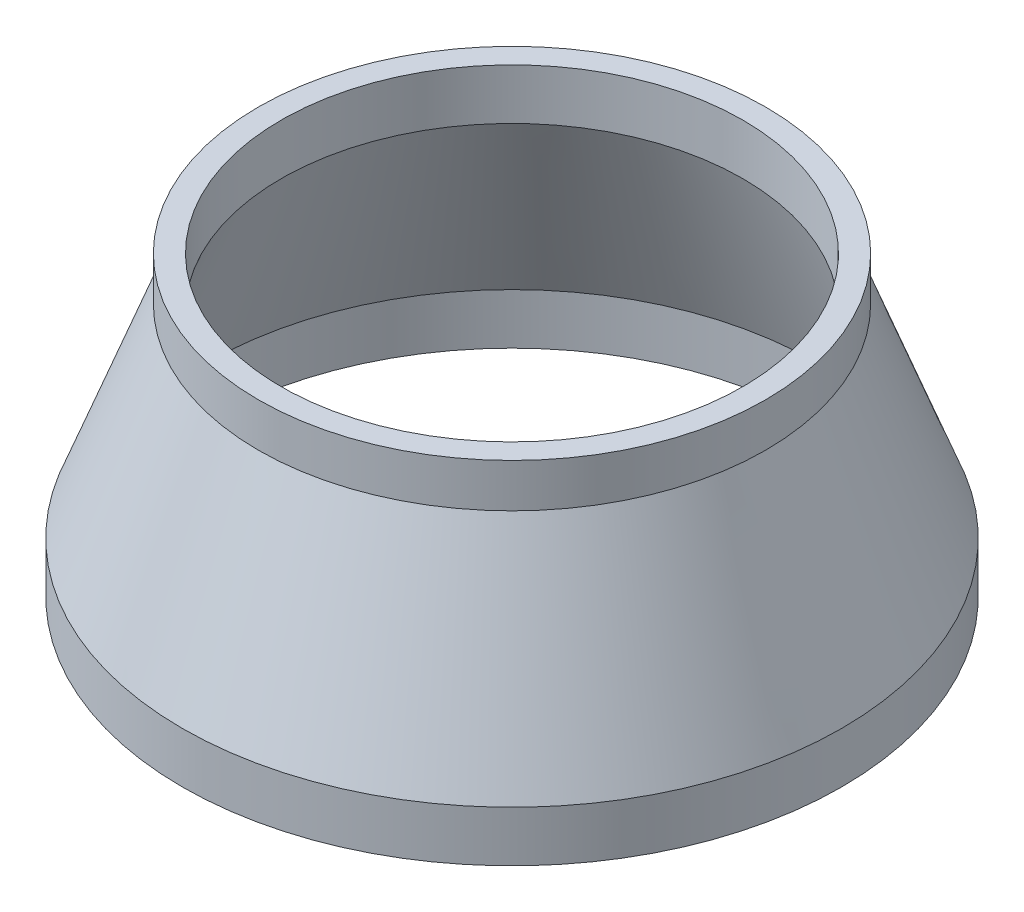
ISO-10303-21;
HEADER;
FILE_DESCRIPTION(('STEP AP214'),'2;1');
FILE_NAME('part.step','',(''),(''),'','','');
FILE_SCHEMA(('AUTOMOTIVE_DESIGN { 1 0 10303 214 1 1 1 1 }'));
ENDSEC;
DATA;
#1=APPLICATION_CONTEXT('core data for automotive mechanical design processes');
#2=APPLICATION_PROTOCOL_DEFINITION('international standard','automotive_design',2000,#1);
#3=PRODUCT_CONTEXT('',#1,'mechanical');
#4=PRODUCT('Part','Part','',(#3));
#5=PRODUCT_RELATED_PRODUCT_CATEGORY('part','',(#4));
#6=PRODUCT_DEFINITION_FORMATION('','',#4);
#7=PRODUCT_DEFINITION_CONTEXT('part definition',#1,'design');
#8=PRODUCT_DEFINITION('design','',#6,#7);
#9=PRODUCT_DEFINITION_SHAPE('','',#8);
#10=(LENGTH_UNIT() NAMED_UNIT(*) SI_UNIT(.MILLI.,.METRE.));
#11=(NAMED_UNIT(*) PLANE_ANGLE_UNIT() SI_UNIT($,.RADIAN.));
#12=(NAMED_UNIT(*) SI_UNIT($,.STERADIAN.) SOLID_ANGLE_UNIT());
#13=UNCERTAINTY_MEASURE_WITH_UNIT(LENGTH_MEASURE(1.E-05),#10,'distance_accuracy_value','');
#14=(GEOMETRIC_REPRESENTATION_CONTEXT(3) GLOBAL_UNCERTAINTY_ASSIGNED_CONTEXT((#13)) GLOBAL_UNIT_ASSIGNED_CONTEXT((#10,
#11,#12)) REPRESENTATION_CONTEXT('',''));
#15=CARTESIAN_POINT('',(0.,0.,0.));
#16=DIRECTION('',(0.,0.,1.));
#17=DIRECTION('',(1.,0.,0.));
#18=AXIS2_PLACEMENT_3D('',#15,#16,#17);
#19=CARTESIAN_POINT('',(0.,0.,0.));
#20=DIRECTION('',(0.,-1.,0.));
#21=DIRECTION('',(0.,0.,-1.));
#22=AXIS2_PLACEMENT_3D('',#19,#20,#21);
#23=CYLINDRICAL_SURFACE('',#22,38.1);
#24=CARTESIAN_POINT('',(0.,-6.35,0.));
#25=DIRECTION('',(0.,-1.,0.));
#26=DIRECTION('',(0.,0.,-1.));
#27=AXIS2_PLACEMENT_3D('',#24,#25,#26);
#28=CIRCLE('',#27,38.1);
#29=CARTESIAN_POINT('',(0.,-6.35,-38.1));
#30=VERTEX_POINT('',#29);
#31=EDGE_CURVE('E59',#30,#30,#28,.T.);
#32=ORIENTED_EDGE('',*,*,#31,.T.);
#33=EDGE_LOOP('',(#32));
#34=FACE_BOUND('',#33,.T.);
#35=CARTESIAN_POINT('',(0.,0.,0.));
#36=DIRECTION('',(0.,-1.,0.));
#37=DIRECTION('',(0.,0.,-1.));
#38=AXIS2_PLACEMENT_3D('',#35,#36,#37);
#39=CIRCLE('',#38,38.1);
#40=CARTESIAN_POINT('',(0.,0.,-38.1));
#41=VERTEX_POINT('',#40);
#42=EDGE_CURVE('E10',#41,#41,#39,.T.);
#43=ORIENTED_EDGE('',*,*,#42,.F.);
#44=EDGE_LOOP('',(#43));
#45=FACE_BOUND('',#44,.T.);
#46=ADVANCED_FACE('F31',(#34,#45),#23,.F.);
#47=CARTESIAN_POINT('',(0.,24.514709031602,0.));
#48=DIRECTION('',(0.,-1.,0.));
#49=DIRECTION('',(0.,0.,-1.));
#50=AXIS2_PLACEMENT_3D('',#47,#48,#49);
#51=CONICAL_SURFACE('',#50,28.9069841131492,0.358770670270572);
#52=ORIENTED_EDGE('',*,*,#42,.T.);
#53=EDGE_LOOP('',(#52));
#54=FACE_BOUND('',#53,.T.);
#55=CARTESIAN_POINT('',(0.,24.514709031602,0.));
#56=DIRECTION('',(0.,-1.,0.));
#57=DIRECTION('',(0.,0.,-1.));
#58=AXIS2_PLACEMENT_3D('',#55,#56,#57);
#59=CIRCLE('',#58,28.9069841131492);
#60=CARTESIAN_POINT('',(0.,24.514709031602,-28.9069841131492));
#61=VERTEX_POINT('',#60);
#62=EDGE_CURVE('E37',#61,#61,#59,.T.);
#63=ORIENTED_EDGE('',*,*,#62,.F.);
#64=EDGE_LOOP('',(#63));
#65=FACE_BOUND('',#64,.T.);
#66=ADVANCED_FACE('F77',(#54,#65),#51,.F.);
#67=CARTESIAN_POINT('',(0.,0.,0.));
#68=DIRECTION('',(0.,-1.,0.));
#69=DIRECTION('',(0.,0.,-1.));
#70=AXIS2_PLACEMENT_3D('',#67,#68,#69);
#71=CYLINDRICAL_SURFACE('',#70,28.9069841131492);
#72=ORIENTED_EDGE('',*,*,#62,.T.);
#73=EDGE_LOOP('',(#72));
#74=FACE_BOUND('',#73,.T.);
#75=CARTESIAN_POINT('',(0.,30.864709031602,0.));
#76=DIRECTION('',(0.,-1.,0.));
#77=DIRECTION('',(0.,0.,-1.));
#78=AXIS2_PLACEMENT_3D('',#75,#76,#77);
#79=CIRCLE('',#78,28.9069841131492);
#80=CARTESIAN_POINT('',(0.,30.864709031602,-28.9069841131492));
#81=VERTEX_POINT('',#80);
#82=EDGE_CURVE('E41',#81,#81,#79,.T.);
#83=ORIENTED_EDGE('',*,*,#82,.F.);
#84=EDGE_LOOP('',(#83));
#85=FACE_BOUND('',#84,.T.);
#86=ADVANCED_FACE('F81',(#74,#85),#71,.F.);
#87=CARTESIAN_POINT('',(28.9069841131492,30.864709031602,0.));
#88=DIRECTION('',(0.,1.,0.));
#89=DIRECTION('',(0.,0.,1.));
#90=AXIS2_PLACEMENT_3D('',#87,#88,#89);
#91=PLANE('',#90);
#92=ORIENTED_EDGE('',*,*,#82,.T.);
#93=EDGE_LOOP('',(#92));
#94=FACE_BOUND('',#93,.T.);
#95=CARTESIAN_POINT('',(0.,30.864709031602,0.));
#96=DIRECTION('',(0.,-1.,0.));
#97=DIRECTION('',(0.,0.,-1.));
#98=AXIS2_PLACEMENT_3D('',#95,#96,#97);
#99=CIRCLE('',#98,31.75);
#100=CARTESIAN_POINT('',(0.,30.864709031602,-31.75));
#101=VERTEX_POINT('',#100);
#102=EDGE_CURVE('E45',#101,#101,#99,.T.);
#103=ORIENTED_EDGE('',*,*,#102,.F.);
#104=EDGE_LOOP('',(#103));
#105=FACE_BOUND('',#104,.T.);
#106=ADVANCED_FACE('F85',(#94,#105),#91,.T.);
#107=CARTESIAN_POINT('',(0.,0.,0.));
#108=DIRECTION('',(0.,-1.,0.));
#109=DIRECTION('',(0.,0.,-1.));
#110=AXIS2_PLACEMENT_3D('',#107,#108,#109);
#111=CYLINDRICAL_SURFACE('',#110,31.75);
#112=ORIENTED_EDGE('',*,*,#102,.T.);
#113=EDGE_LOOP('',(#112));
#114=FACE_BOUND('',#113,.T.);
#115=CARTESIAN_POINT('',(0.,25.4,0.));
#116=DIRECTION('',(0.,-1.,0.));
#117=DIRECTION('',(0.,0.,-1.));
#118=AXIS2_PLACEMENT_3D('',#115,#116,#117);
#119=CIRCLE('',#118,31.75);
#120=CARTESIAN_POINT('',(0.,25.4,-31.75));
#121=VERTEX_POINT('',#120);
#122=EDGE_CURVE('E50',#121,#121,#119,.T.);
#123=ORIENTED_EDGE('',*,*,#122,.F.);
#124=EDGE_LOOP('',(#123));
#125=FACE_BOUND('',#124,.T.);
#126=ADVANCED_FACE('F91',(#114,#125),#111,.T.);
#127=CARTESIAN_POINT('',(0.,0.,0.));
#128=DIRECTION('',(0.,-1.,0.));
#129=DIRECTION('',(0.,0.,-1.));
#130=AXIS2_PLACEMENT_3D('',#127,#128,#129);
#131=CONICAL_SURFACE('',#130,41.275,0.358770670270572);
#132=ORIENTED_EDGE('',*,*,#122,.T.);
#133=EDGE_LOOP('',(#132));
#134=FACE_BOUND('',#133,.T.);
#135=CARTESIAN_POINT('',(0.,0.,0.));
#136=DIRECTION('',(0.,-1.,0.));
#137=DIRECTION('',(0.,0.,-1.));
#138=AXIS2_PLACEMENT_3D('',#135,#136,#137);
#139=CIRCLE('',#138,41.275);
#140=CARTESIAN_POINT('',(0.,0.,-41.275));
#141=VERTEX_POINT('',#140);
#142=EDGE_CURVE('E53',#141,#141,#139,.T.);
#143=ORIENTED_EDGE('',*,*,#142,.F.);
#144=EDGE_LOOP('',(#143));
#145=FACE_BOUND('',#144,.T.);
#146=ADVANCED_FACE('F73',(#134,#145),#131,.T.);
#147=CARTESIAN_POINT('',(0.,0.,0.));
#148=DIRECTION('',(0.,-1.,0.));
#149=DIRECTION('',(0.,0.,-1.));
#150=AXIS2_PLACEMENT_3D('',#147,#148,#149);
#151=CYLINDRICAL_SURFACE('',#150,41.275);
#152=ORIENTED_EDGE('',*,*,#142,.T.);
#153=EDGE_LOOP('',(#152));
#154=FACE_BOUND('',#153,.T.);
#155=CARTESIAN_POINT('',(0.,-6.35,0.));
#156=DIRECTION('',(0.,-1.,0.));
#157=DIRECTION('',(0.,0.,-1.));
#158=AXIS2_PLACEMENT_3D('',#155,#156,#157);
#159=CIRCLE('',#158,41.275);
#160=CARTESIAN_POINT('',(0.,-6.35,-41.275));
#161=VERTEX_POINT('',#160);
#162=EDGE_CURVE('E56',#161,#161,#159,.T.);
#163=ORIENTED_EDGE('',*,*,#162,.F.);
#164=EDGE_LOOP('',(#163));
#165=FACE_BOUND('',#164,.T.);
#166=ADVANCED_FACE('F67',(#154,#165),#151,.T.);
#167=CARTESIAN_POINT('',(41.275,-6.35,0.));
#168=DIRECTION('',(0.,-1.,0.));
#169=DIRECTION('',(0.,0.,-1.));
#170=AXIS2_PLACEMENT_3D('',#167,#168,#169);
#171=PLANE('',#170);
#172=ORIENTED_EDGE('',*,*,#162,.T.);
#173=EDGE_LOOP('',(#172));
#174=FACE_BOUND('',#173,.T.);
#175=ORIENTED_EDGE('',*,*,#31,.F.);
#176=EDGE_LOOP('',(#175));
#177=FACE_BOUND('',#176,.T.);
#178=ADVANCED_FACE('F65',(#174,#177),#171,.T.);
#179=CLOSED_SHELL('',(#46,#66,#86,#106,#126,#146,#166,#178));
#180=MANIFOLD_SOLID_BREP('B2',#179);
#181=ADVANCED_BREP_SHAPE_REPRESENTATION('',(#18,#180),#14);
#182=SHAPE_DEFINITION_REPRESENTATION(#9,#181);
ENDSEC;
END-ISO-10303-21;
